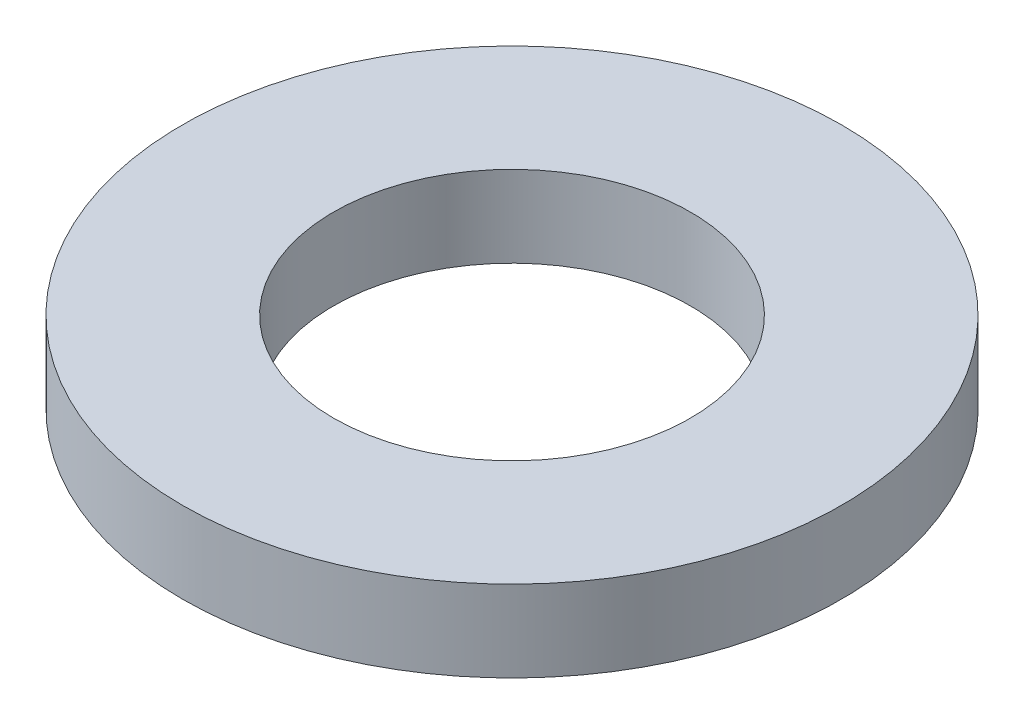
ISO-10303-21;
HEADER;
FILE_DESCRIPTION(('STEP AP214'),'2;1');
FILE_NAME('part.step','',(''),(''),'','','');
FILE_SCHEMA(('AUTOMOTIVE_DESIGN { 1 0 10303 214 1 1 1 1 }'));
ENDSEC;
DATA;
#1=APPLICATION_CONTEXT('core data for automotive mechanical design processes');
#2=APPLICATION_PROTOCOL_DEFINITION('international standard','automotive_design',2000,#1);
#3=PRODUCT_CONTEXT('',#1,'mechanical');
#4=PRODUCT('Part','Part','',(#3));
#5=PRODUCT_RELATED_PRODUCT_CATEGORY('part','',(#4));
#6=PRODUCT_DEFINITION_FORMATION('','',#4);
#7=PRODUCT_DEFINITION_CONTEXT('part definition',#1,'design');
#8=PRODUCT_DEFINITION('design','',#6,#7);
#9=PRODUCT_DEFINITION_SHAPE('','',#8);
#10=(LENGTH_UNIT() NAMED_UNIT(*) SI_UNIT(.MILLI.,.METRE.));
#11=(NAMED_UNIT(*) PLANE_ANGLE_UNIT() SI_UNIT($,.RADIAN.));
#12=(NAMED_UNIT(*) SI_UNIT($,.STERADIAN.) SOLID_ANGLE_UNIT());
#13=UNCERTAINTY_MEASURE_WITH_UNIT(LENGTH_MEASURE(1.E-05),#10,'distance_accuracy_value','');
#14=(GEOMETRIC_REPRESENTATION_CONTEXT(3) GLOBAL_UNCERTAINTY_ASSIGNED_CONTEXT((#13)) GLOBAL_UNIT_ASSIGNED_CONTEXT((#10,
#11,#12)) REPRESENTATION_CONTEXT('',''));
#15=CARTESIAN_POINT('',(0.,0.,0.));
#16=DIRECTION('',(0.,0.,1.));
#17=DIRECTION('',(1.,0.,0.));
#18=AXIS2_PLACEMENT_3D('',#15,#16,#17);
#19=CARTESIAN_POINT('',(0.,0.74,0.));
#20=DIRECTION('',(0.,1.,0.));
#21=DIRECTION('',(0.,0.,1.));
#22=AXIS2_PLACEMENT_3D('',#19,#20,#21);
#23=PLANE('',#22);
#24=CARTESIAN_POINT('',(0.,0.74,0.));
#25=DIRECTION('',(0.,1.,0.));
#26=DIRECTION('',(0.,0.,1.));
#27=AXIS2_PLACEMENT_3D('',#24,#25,#26);
#28=CIRCLE('',#27,6.);
#29=CARTESIAN_POINT('',(0.,0.74,6.));
#30=VERTEX_POINT('',#29);
#31=EDGE_CURVE('E10',#30,#30,#28,.T.);
#32=ORIENTED_EDGE('',*,*,#31,.T.);
#33=EDGE_LOOP('',(#32));
#34=FACE_BOUND('',#33,.T.);
#35=CARTESIAN_POINT('',(0.,0.74,0.));
#36=DIRECTION('',(0.,1.,0.));
#37=DIRECTION('',(0.,0.,1.));
#38=AXIS2_PLACEMENT_3D('',#35,#36,#37);
#39=CIRCLE('',#38,3.25);
#40=CARTESIAN_POINT('',(0.,0.74,3.25));
#41=VERTEX_POINT('',#40);
#42=EDGE_CURVE('E48',#41,#41,#39,.T.);
#43=ORIENTED_EDGE('',*,*,#42,.F.);
#44=EDGE_LOOP('',(#43));
#45=FACE_BOUND('',#44,.T.);
#46=ADVANCED_FACE('F37',(#34,#45),#23,.T.);
#47=CARTESIAN_POINT('',(0.,-0.74,0.));
#48=DIRECTION('',(0.,1.,0.));
#49=DIRECTION('',(0.,0.,1.));
#50=AXIS2_PLACEMENT_3D('',#47,#48,#49);
#51=PLANE('',#50);
#52=CARTESIAN_POINT('',(0.,-0.74,0.));
#53=DIRECTION('',(0.,1.,0.));
#54=DIRECTION('',(0.,0.,1.));
#55=AXIS2_PLACEMENT_3D('',#52,#53,#54);
#56=CIRCLE('',#55,6.);
#57=CARTESIAN_POINT('',(0.,-0.74,6.));
#58=VERTEX_POINT('',#57);
#59=EDGE_CURVE('E41',#58,#58,#56,.T.);
#60=ORIENTED_EDGE('',*,*,#59,.F.);
#61=EDGE_LOOP('',(#60));
#62=FACE_BOUND('',#61,.T.);
#63=CARTESIAN_POINT('',(0.,-0.74,0.));
#64=DIRECTION('',(0.,1.,0.));
#65=DIRECTION('',(0.,0.,1.));
#66=AXIS2_PLACEMENT_3D('',#63,#64,#65);
#67=CIRCLE('',#66,3.25);
#68=CARTESIAN_POINT('',(0.,-0.74,3.25));
#69=VERTEX_POINT('',#68);
#70=EDGE_CURVE('E50',#69,#69,#67,.T.);
#71=ORIENTED_EDGE('',*,*,#70,.T.);
#72=EDGE_LOOP('',(#71));
#73=FACE_BOUND('',#72,.T.);
#74=ADVANCED_FACE('F60',(#62,#73),#51,.F.);
#75=CARTESIAN_POINT('',(0.,0.74,0.));
#76=DIRECTION('',(0.,-1.,0.));
#77=DIRECTION('',(0.,0.,-1.));
#78=AXIS2_PLACEMENT_3D('',#75,#76,#77);
#79=CYLINDRICAL_SURFACE('',#78,6.);
#80=ORIENTED_EDGE('',*,*,#31,.F.);
#81=EDGE_LOOP('',(#80));
#82=FACE_BOUND('',#81,.T.);
#83=ORIENTED_EDGE('',*,*,#59,.T.);
#84=EDGE_LOOP('',(#83));
#85=FACE_BOUND('',#84,.T.);
#86=ADVANCED_FACE('F39',(#82,#85),#79,.T.);
#87=CARTESIAN_POINT('',(0.,0.74,0.));
#88=DIRECTION('',(0.,-1.,0.));
#89=DIRECTION('',(0.,0.,-1.));
#90=AXIS2_PLACEMENT_3D('',#87,#88,#89);
#91=CYLINDRICAL_SURFACE('',#90,3.25);
#92=ORIENTED_EDGE('',*,*,#42,.T.);
#93=EDGE_LOOP('',(#92));
#94=FACE_BOUND('',#93,.T.);
#95=ORIENTED_EDGE('',*,*,#70,.F.);
#96=EDGE_LOOP('',(#95));
#97=FACE_BOUND('',#96,.T.);
#98=ADVANCED_FACE('F56',(#94,#97),#91,.F.);
#99=CLOSED_SHELL('',(#46,#74,#86,#98));
#100=MANIFOLD_SOLID_BREP('B2',#99);
#101=ADVANCED_BREP_SHAPE_REPRESENTATION('',(#18,#100),#14);
#102=SHAPE_DEFINITION_REPRESENTATION(#9,#101);
ENDSEC;
END-ISO-10303-21;
